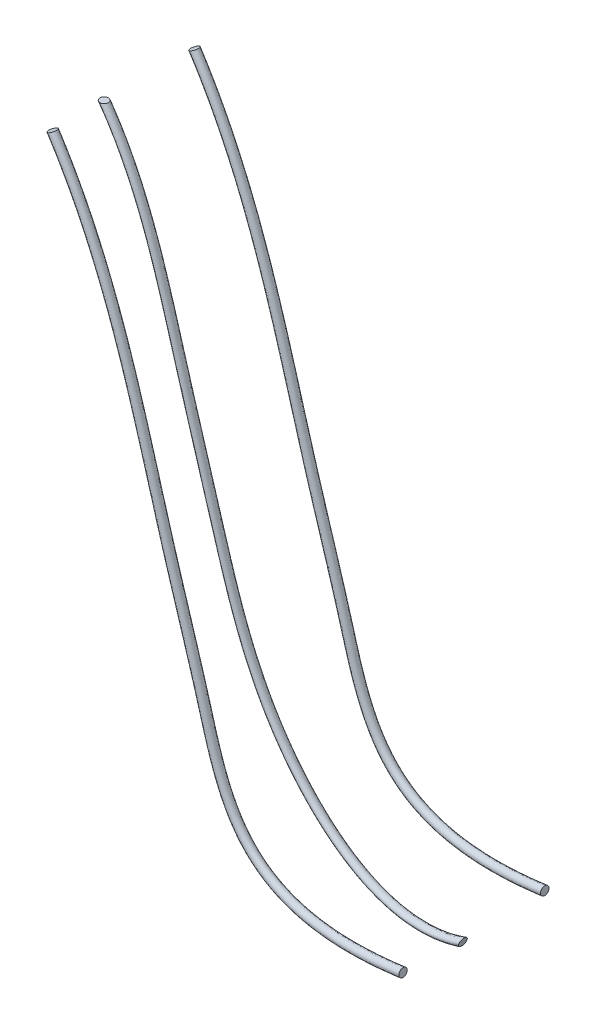
ISO-10303-21;
HEADER;
FILE_DESCRIPTION(('STEP AP214'),'2;1');
FILE_NAME('part.step','',(''),(''),'','','');
FILE_SCHEMA(('AUTOMOTIVE_DESIGN { 1 0 10303 214 1 1 1 1 }'));
ENDSEC;
DATA;
#1=APPLICATION_CONTEXT('core data for automotive mechanical design processes');
#2=APPLICATION_PROTOCOL_DEFINITION('international standard','automotive_design',2000,#1);
#3=PRODUCT_CONTEXT('',#1,'mechanical');
#4=PRODUCT('Part','Part','',(#3));
#5=PRODUCT_RELATED_PRODUCT_CATEGORY('part','',(#4));
#6=PRODUCT_DEFINITION_FORMATION('','',#4);
#7=PRODUCT_DEFINITION_CONTEXT('part definition',#1,'design');
#8=PRODUCT_DEFINITION('design','',#6,#7);
#9=PRODUCT_DEFINITION_SHAPE('','',#8);
#10=(LENGTH_UNIT() NAMED_UNIT(*) SI_UNIT(.MILLI.,.METRE.));
#11=(NAMED_UNIT(*) PLANE_ANGLE_UNIT() SI_UNIT($,.RADIAN.));
#12=(NAMED_UNIT(*) SI_UNIT($,.STERADIAN.) SOLID_ANGLE_UNIT());
#13=UNCERTAINTY_MEASURE_WITH_UNIT(LENGTH_MEASURE(1.E-05),#10,'distance_accuracy_value','');
#14=(GEOMETRIC_REPRESENTATION_CONTEXT(3) GLOBAL_UNCERTAINTY_ASSIGNED_CONTEXT((#13)) GLOBAL_UNIT_ASSIGNED_CONTEXT((#10,
#11,#12)) REPRESENTATION_CONTEXT('',''));
#15=CARTESIAN_POINT('',(0.,0.,0.));
#16=DIRECTION('',(0.,0.,1.));
#17=DIRECTION('',(1.,0.,0.));
#18=AXIS2_PLACEMENT_3D('',#15,#16,#17);
#19=CARTESIAN_POINT('',(16.916534127983,-52.611531021806,-35.));
#20=DIRECTION('',(-0.958927457331722,0.283651426182417,0.));
#21=DIRECTION('',(0.,0.,1.));
#22=AXIS2_PLACEMENT_3D('',#19,#20,#21);
#23=PLANE('',#22);
#24=CARTESIAN_POINT('',(16.916534127983,-52.611531021806,-35.));
#25=DIRECTION('',(-0.958927457331722,0.283651426182417,0.));
#26=DIRECTION('',(0.,0.,1.));
#27=AXIS2_PLACEMENT_3D('',#24,#25,#26);
#28=CIRCLE('',#27,1.5);
#29=CARTESIAN_POINT('',(16.916534127983,-52.611531021806,-33.5));
#30=VERTEX_POINT('',#29);
#31=EDGE_CURVE('E52',#30,#30,#28,.T.);
#32=ORIENTED_EDGE('',*,*,#31,.F.);
#33=EDGE_LOOP('',(#32));
#34=FACE_BOUND('',#33,.T.);
#35=ADVANCED_FACE('F45',(#34),#23,.F.);
#36=CARTESIAN_POINT('',(-109.591861813485,141.197501941776,-35.));
#37=DIRECTION('',(0.,1.,0.));
#38=DIRECTION('',(0.,0.,1.));
#39=AXIS2_PLACEMENT_3D('',#36,#37,#38);
#40=PLANE('',#39);
#41=CARTESIAN_POINT('',(-109.591861813485,141.197501941776,-35.));
#42=DIRECTION('',(0.,1.,0.));
#43=DIRECTION('',(0.,0.,1.));
#44=AXIS2_PLACEMENT_3D('',#41,#42,#43);
#45=CIRCLE('',#44,1.5);
#46=CARTESIAN_POINT('',(-109.591861813485,141.197501941776,-33.5));
#47=VERTEX_POINT('',#46);
#48=EDGE_CURVE('E12',#47,#47,#45,.T.);
#49=ORIENTED_EDGE('',*,*,#48,.T.);
#50=EDGE_LOOP('',(#49));
#51=FACE_BOUND('',#50,.T.);
#52=ADVANCED_FACE('F59',(#51),#40,.T.);
#53=CARTESIAN_POINT('',(16.916534127983,-52.611531021806,-33.5));
#54=CARTESIAN_POINT('',(9.55705648597828,-55.1380302823063,-33.5));
#55=CARTESIAN_POINT('',(2.43598615035813,-55.5558375818441,-33.5));
#56=CARTESIAN_POINT('',(-11.0949119735034,-53.168356726781,-33.5));
#57=CARTESIAN_POINT('',(-17.5047397627201,-50.3630685711351,-33.5));
#58=CARTESIAN_POINT('',(-35.315717416291,-38.603993631756,-33.5));
#59=CARTESIAN_POINT('',(-45.2983615667628,-26.306996369571,-33.5000000000508));
#60=CARTESIAN_POINT('',(-60.4202481334853,0.703109142676461,-33.4999999999434));
#61=CARTESIAN_POINT('',(-64.878410153124,15.5318857768422,-33.4999999999459));
#62=CARTESIAN_POINT('',(-74.0719650388109,46.0665955853019,-33.5000000000565));
#63=CARTESIAN_POINT('',(-78.8109689398716,61.7825785006327,-33.5000000000573));
#64=CARTESIAN_POINT('',(-86.6687995899401,88.7315740177395,-33.4999999999599));
#65=CARTESIAN_POINT('',(-89.8483885261062,99.899973826744,-33.5));
#66=CARTESIAN_POINT('',(-97.9491688366467,121.408362716194,-33.5));
#67=CARTESIAN_POINT('',(-102.870360210734,131.7483517967,-33.4999999998793));
#68=CARTESIAN_POINT('',(-109.591861813485,141.197501941776,-33.5));
#69=CARTESIAN_POINT('',(17.7674884065303,-49.7347486498109,-33.5));
#70=CARTESIAN_POINT('',(10.8805138453547,-52.4010146587241,-33.499999999946));
#71=CARTESIAN_POINT('',(4.23639829818887,-53.1086093205455,-33.5));
#72=CARTESIAN_POINT('',(-8.62080221794834,-51.4050669086179,-33.5));
#73=CARTESIAN_POINT('',(-14.8273642347094,-48.9689108106232,-33.5));
#74=CARTESIAN_POINT('',(-32.2762114074672,-38.1463195765031,-33.5));
#75=CARTESIAN_POINT('',(-42.276048485128,-26.2630477572454,-33.5000000000508));
#76=CARTESIAN_POINT('',(-57.4819897006809,-0.0288475938846101,-33.4999999999434));
#77=CARTESIAN_POINT('',(-62.0365207476715,14.5708107264407,-33.4999999999459));
#78=CARTESIAN_POINT('',(-71.2295501301309,45.1070758149353,-33.5000000000565));
#79=CARTESIAN_POINT('',(-75.9713417112433,60.8146690381452,-33.5000000000573));
#80=CARTESIAN_POINT('',(-83.8393424623326,87.7344104026176,-33.4999999999599));
#81=CARTESIAN_POINT('',(-86.9904353661716,98.9725733570331,-33.5));
#82=CARTESIAN_POINT('',(-95.0058468682263,120.804356353894,-33.5));
#83=CARTESIAN_POINT('',(-99.8703602107739,131.406267637954,-33.4999999998793));
#84=CARTESIAN_POINT('',(-106.591861813485,141.197501941776,-33.5));
#85=CARTESIAN_POINT('',(17.7674884065303,-49.7347486498109,-36.5));
#86=CARTESIAN_POINT('',(10.8805138453547,-52.4010146587241,-36.499999999946));
#87=CARTESIAN_POINT('',(4.23639829818887,-53.1086093205455,-36.5));
#88=CARTESIAN_POINT('',(-8.62080221794834,-51.4050669086179,-36.5));
#89=CARTESIAN_POINT('',(-14.8273642347094,-48.9689108106232,-36.5));
#90=CARTESIAN_POINT('',(-32.2762114074672,-38.1463195765031,-36.5));
#91=CARTESIAN_POINT('',(-42.276048485128,-26.2630477572455,-36.5000000000508));
#92=CARTESIAN_POINT('',(-57.4819897006809,-0.0288475938846032,-36.4999999999434));
#93=CARTESIAN_POINT('',(-62.0365207476715,14.5708107266572,-36.4999999999459));
#94=CARTESIAN_POINT('',(-71.2295501301309,45.1070758147093,-36.5000000000565));
#95=CARTESIAN_POINT('',(-75.9713417112433,60.8146690381452,-36.5000000000572));
#96=CARTESIAN_POINT('',(-83.8393424623326,87.7344104026176,-36.4999999999599));
#97=CARTESIAN_POINT('',(-86.9904353661716,98.9725733570331,-36.5));
#98=CARTESIAN_POINT('',(-95.0058468682263,120.804356353894,-36.5));
#99=CARTESIAN_POINT('',(-99.8703602107739,131.406267637954,-36.4999999998793));
#100=CARTESIAN_POINT('',(-106.591861813485,141.197501941776,-36.5));
#101=CARTESIAN_POINT('',(16.916534127983,-52.611531021806,-36.5));
#102=CARTESIAN_POINT('',(9.55705648597828,-55.1380302823063,-36.5));
#103=CARTESIAN_POINT('',(2.43598615035813,-55.5558375818441,-36.5));
#104=CARTESIAN_POINT('',(-11.0949119735034,-53.168356726781,-36.5));
#105=CARTESIAN_POINT('',(-17.5047397627201,-50.3630685711351,-36.5));
#106=CARTESIAN_POINT('',(-35.315717416291,-38.603993631756,-36.5));
#107=CARTESIAN_POINT('',(-45.2983615667628,-26.306996369571,-36.5000000000508));
#108=CARTESIAN_POINT('',(-60.4202481334853,0.703109142676461,-36.4999999999434));
#109=CARTESIAN_POINT('',(-64.878410153124,15.5318857770587,-36.4999999999459));
#110=CARTESIAN_POINT('',(-74.0719650388109,46.0665955850759,-36.5000000000565));
#111=CARTESIAN_POINT('',(-78.8109689398716,61.7825785006327,-36.5000000000572));
#112=CARTESIAN_POINT('',(-86.6687995899401,88.7315740177395,-36.4999999999599));
#113=CARTESIAN_POINT('',(-89.8483885261062,99.899973826744,-36.5));
#114=CARTESIAN_POINT('',(-97.9491688366467,121.408362716194,-36.5));
#115=CARTESIAN_POINT('',(-102.870360210734,131.7483517967,-36.4999999998793));
#116=CARTESIAN_POINT('',(-109.591861813485,141.197501941776,-36.5));
#117=CARTESIAN_POINT('',(16.0655798494358,-55.4883133938011,-36.5));
#118=CARTESIAN_POINT('',(8.23359912660187,-57.8750459058886,-36.500000000054));
#119=CARTESIAN_POINT('',(0.635574002527383,-58.0030658431427,-36.5));
#120=CARTESIAN_POINT('',(-13.5690217290585,-54.9316465449442,-36.5));
#121=CARTESIAN_POINT('',(-20.1821152907308,-51.7572263316469,-36.5));
#122=CARTESIAN_POINT('',(-38.3552234251148,-39.0616676870089,-36.5));
#123=CARTESIAN_POINT('',(-48.3206746483976,-26.3509449818966,-36.5000000000508));
#124=CARTESIAN_POINT('',(-63.3585065662897,1.43506587923753,-36.4999999999434));
#125=CARTESIAN_POINT('',(-67.7202995585765,16.4929608274602,-36.4999999999459));
#126=CARTESIAN_POINT('',(-76.9143799474908,47.0261153554425,-36.5000000000565));
#127=CARTESIAN_POINT('',(-81.6505961685,62.7504879631201,-36.5000000000572));
#128=CARTESIAN_POINT('',(-89.4982567175476,89.7287376328614,-36.4999999999599));
#129=CARTESIAN_POINT('',(-92.7063416860409,100.827374296455,-36.5));
#130=CARTESIAN_POINT('',(-100.892490805067,122.012369078494,-36.5));
#131=CARTESIAN_POINT('',(-105.870360210693,132.090435955447,-36.4999999998793));
#132=CARTESIAN_POINT('',(-112.591861813485,141.197501941776,-36.5));
#133=CARTESIAN_POINT('',(16.0655798494358,-55.4883133938011,-33.5));
#134=CARTESIAN_POINT('',(8.23359912660187,-57.8750459058886,-33.500000000054));
#135=CARTESIAN_POINT('',(0.635574002527383,-58.0030658431427,-33.5));
#136=CARTESIAN_POINT('',(-13.5690217290585,-54.9316465449442,-33.5));
#137=CARTESIAN_POINT('',(-20.1821152907308,-51.7572263316469,-33.5));
#138=CARTESIAN_POINT('',(-38.3552234251148,-39.0616676870089,-33.5));
#139=CARTESIAN_POINT('',(-48.3206746483976,-26.3509449818966,-33.5000000000508));
#140=CARTESIAN_POINT('',(-63.3585065662898,1.43506587923753,-33.4999999999434));
#141=CARTESIAN_POINT('',(-67.7202995585765,16.4929608272437,-33.4999999999459));
#142=CARTESIAN_POINT('',(-76.9143799474908,47.0261153556685,-33.5000000000565));
#143=CARTESIAN_POINT('',(-81.6505961685,62.7504879631201,-33.5000000000573));
#144=CARTESIAN_POINT('',(-89.4982567175476,89.7287376328614,-33.4999999999599));
#145=CARTESIAN_POINT('',(-92.7063416860409,100.827374296455,-33.5));
#146=CARTESIAN_POINT('',(-100.892490805067,122.012369078494,-33.5));
#147=CARTESIAN_POINT('',(-105.870360210693,132.090435955447,-33.4999999998793));
#148=CARTESIAN_POINT('',(-112.591861813485,141.197501941776,-33.5));
#149=CARTESIAN_POINT('',(16.916534127983,-52.611531021806,-33.5));
#150=CARTESIAN_POINT('',(9.55705648597828,-55.1380302823063,-33.5));
#151=CARTESIAN_POINT('',(2.43598615035813,-55.5558375818441,-33.5));
#152=CARTESIAN_POINT('',(-11.0949119735034,-53.168356726781,-33.5));
#153=CARTESIAN_POINT('',(-17.5047397627201,-50.3630685711351,-33.5));
#154=CARTESIAN_POINT('',(-35.315717416291,-38.603993631756,-33.5));
#155=CARTESIAN_POINT('',(-45.2983615667628,-26.306996369571,-33.5000000000508));
#156=CARTESIAN_POINT('',(-60.4202481334853,0.703109142676461,-33.4999999999434));
#157=CARTESIAN_POINT('',(-64.878410153124,15.5318857768422,-33.4999999999459));
#158=CARTESIAN_POINT('',(-74.0719650388109,46.0665955853019,-33.5000000000565));
#159=CARTESIAN_POINT('',(-78.8109689398716,61.7825785006327,-33.5000000000573));
#160=CARTESIAN_POINT('',(-86.6687995899401,88.7315740177395,-33.4999999999599));
#161=CARTESIAN_POINT('',(-89.8483885261062,99.899973826744,-33.5));
#162=CARTESIAN_POINT('',(-97.9491688366467,121.408362716194,-33.5));
#163=CARTESIAN_POINT('',(-102.870360210734,131.7483517967,-33.4999999998793));
#164=CARTESIAN_POINT('',(-109.591861813485,141.197501941776,-33.5));
#165=(BOUNDED_SURFACE() B_SPLINE_SURFACE(3,3,((#53,#54,#55,#56,#57,#58,#59,#60,#61,#62,#63,#64,
#65,#66,#67,#68),(#69,#70,#71,#72,#73,#74,#75,#76,#77,#78,#79,#80,#81,#82,#83,#84),(#85,#86,#87,
#88,#89,#90,#91,#92,#93,#94,#95,#96,#97,#98,#99,#100),(#101,#102,#103,#104,#105,#106,#107,#108,
#109,#110,#111,#112,#113,#114,#115,#116),(#117,#118,#119,#120,#121,#122,#123,#124,#125,#126,
#127,#128,#129,#130,#131,#132),(#133,#134,#135,#136,#137,#138,#139,#140,#141,#142,#143,#144,
#145,#146,#147,#148),(#149,#150,#151,#152,#153,#154,#155,#156,#157,#158,#159,#160,#161,#162,
#163,#164)),.UNSPECIFIED.,.T.,.F.,.F.) B_SPLINE_SURFACE_WITH_KNOTS((4,3,4),(4,2,2,2,2,2,2,4),
(0.,0.5,1.),(0.,0.0846577276563609,0.169315455312722,0.338630910625443,0.527229255251966,
0.724052923284721,0.862026461642361,1.),
.UNSPECIFIED.) GEOMETRIC_REPRESENTATION_ITEM() RATIONAL_B_SPLINE_SURFACE(((1.,1.,1.,1.,1.,1.,1.,
1.,1.,1.,1.,1.,1.,1.,1.,1.),(0.333333333333333,0.333333333333333,0.333333333333333,
0.333333333333333,0.333333333333333,0.333333333333333,0.333333333333333,0.333333333333333,
0.333333333333333,0.333333333333333,0.333333333333333,0.333333333333333,0.333333333333333,
0.333333333333333,0.333333333333333,0.333333333333333),(0.333333333333333,0.333333333333333,
0.333333333333333,0.333333333333333,0.333333333333333,0.333333333333333,0.333333333333333,
0.333333333333333,0.333333333333333,0.333333333333333,0.333333333333333,0.333333333333333,
0.333333333333333,0.333333333333333,0.333333333333333,0.333333333333333),(1.,1.,1.,1.,1.,1.,1.,
1.,1.,1.,1.,1.,1.,1.,1.,1.),(0.333333333333333,0.333333333333333,0.333333333333333,
0.333333333333333,0.333333333333333,0.333333333333333,0.333333333333333,0.333333333333333,
0.333333333333333,0.333333333333333,0.333333333333333,0.333333333333333,0.333333333333333,
0.333333333333333,0.333333333333333,0.333333333333333),(0.333333333333333,0.333333333333333,
0.333333333333333,0.333333333333333,0.333333333333333,0.333333333333333,0.333333333333333,
0.333333333333333,0.333333333333333,0.333333333333333,0.333333333333333,0.333333333333333,
0.333333333333333,0.333333333333333,0.333333333333333,0.333333333333333),(1.,1.,1.,1.,1.,1.,1.,
1.,1.,1.,1.,1.,1.,1.,1.,1.))) REPRESENTATION_ITEM('') SURFACE());
#166=ORIENTED_EDGE('',*,*,#48,.F.);
#167=EDGE_LOOP('',(#166));
#168=FACE_BOUND('',#167,.T.);
#169=ORIENTED_EDGE('',*,*,#31,.T.);
#170=EDGE_LOOP('',(#169));
#171=FACE_BOUND('',#170,.T.);
#172=ADVANCED_FACE('F61',(#168,#171),#165,.T.);
#173=CLOSED_SHELL('',(#35,#52,#172));
#174=MANIFOLD_SOLID_BREP('B2',#173);
#175=CARTESIAN_POINT('',(20.7871925197467,-47.5155249257654,-60.));
#176=DIRECTION('',(1.,0.,0.));
#177=DIRECTION('',(0.,0.,-1.));
#178=AXIS2_PLACEMENT_3D('',#175,#176,#177);
#179=PLANE('',#178);
#180=CARTESIAN_POINT('',(20.7871925197467,-47.5155249257654,-60.));
#181=DIRECTION('',(1.,0.,0.));
#182=DIRECTION('',(0.,0.,-1.));
#183=AXIS2_PLACEMENT_3D('',#180,#181,#182);
#184=CIRCLE('',#183,1.5);
#185=CARTESIAN_POINT('',(20.7871925197467,-47.5155249257654,-61.5));
#186=VERTEX_POINT('',#185);
#187=EDGE_CURVE('E110',#186,#186,#184,.T.);
#188=ORIENTED_EDGE('',*,*,#187,.T.);
#189=EDGE_LOOP('',(#188));
#190=FACE_BOUND('',#189,.T.);
#191=ADVANCED_FACE('F103',(#190),#179,.T.);
#192=CARTESIAN_POINT('',(-102.757957414721,147.936211365141,-60.));
#193=DIRECTION('',(0.421750342883305,-0.906711998529751,0.));
#194=DIRECTION('',(0.,0.,-1.));
#195=AXIS2_PLACEMENT_3D('',#192,#193,#194);
#196=PLANE('',#195);
#197=CARTESIAN_POINT('',(-102.757957414721,147.936211365141,-60.));
#198=DIRECTION('',(0.421750342883305,-0.906711998529751,0.));
#199=DIRECTION('',(0.,0.,-1.));
#200=AXIS2_PLACEMENT_3D('',#197,#198,#199);
#201=CIRCLE('',#200,1.5);
#202=CARTESIAN_POINT('',(-102.757957414721,147.936211365141,-61.5));
#203=VERTEX_POINT('',#202);
#204=EDGE_CURVE('E43',#203,#203,#201,.T.);
#205=ORIENTED_EDGE('',*,*,#204,.F.);
#206=EDGE_LOOP('',(#205));
#207=FACE_BOUND('',#206,.T.);
#208=ADVANCED_FACE('F119',(#207),#196,.F.);
#209=CARTESIAN_POINT('',(20.7871925197467,-47.5155249257654,-61.5));
#210=CARTESIAN_POINT('',(6.67032582434194,-49.4776645493738,-61.5));
#211=CARTESIAN_POINT('',(-4.29139426145453,-49.2009446173639,-61.5));
#212=CARTESIAN_POINT('',(-21.5401859863186,-45.3074124619637,-61.5));
#213=CARTESIAN_POINT('',(-27.827257623269,-41.6906002375903,-61.5));
#214=CARTESIAN_POINT('',(-37.3623972233158,-32.2545103218831,-61.5));
#215=CARTESIAN_POINT('',(-40.6104651827423,-26.4352326278541,-61.5));
#216=CARTESIAN_POINT('',(-45.7032421986823,-13.7318385949111,-61.5));
#217=CARTESIAN_POINT('',(-47.5479512519977,-6.84772225350563,-61.5000000000247));
#218=CARTESIAN_POINT('',(-53.3149364191524,13.2918461274146,-61.499999999952));
#219=CARTESIAN_POINT('',(-57.558663360849,26.4465696156744,-61.5));
#220=CARTESIAN_POINT('',(-67.0231898161266,58.2397176307574,-61.5));
#221=CARTESIAN_POINT('',(-71.9580815041171,76.971572830989,-61.5));
#222=CARTESIAN_POINT('',(-84.446806300493,113.492342820483,-61.5));
#223=CARTESIAN_POINT('',(-92.0006394080635,131.281257610009,-61.5));
#224=CARTESIAN_POINT('',(-102.757957414721,147.936211365141,-61.5));
#225=CARTESIAN_POINT('',(20.7871925197467,-44.5155249257654,-61.5));
#226=CARTESIAN_POINT('',(6.92055083697571,-46.4776645493491,-61.5));
#227=CARTESIAN_POINT('',(-3.68807037354514,-46.2224964242823,-61.5));
#228=CARTESIAN_POINT('',(-20.0292196853693,-42.6707224557401,-61.5));
#229=CARTESIAN_POINT('',(-25.7787964130944,-39.4303756113549,-61.5));
#230=CARTESIAN_POINT('',(-34.6434899554663,-30.8716321778494,-61.5));
#231=CARTESIAN_POINT('',(-37.758504023246,-25.4719326589793,-61.5));
#232=CARTESIAN_POINT('',(-42.7317306964101,-13.2504357716397,-61.5));
#233=CARTESIAN_POINT('',(-44.5728376137831,-6.46059722549588,-61.5000000000247));
#234=CARTESIAN_POINT('',(-50.3539201014126,13.7784456497104,-61.499999999952));
#235=CARTESIAN_POINT('',(-54.599747060689,26.9434377008006,-61.5));
#236=CARTESIAN_POINT('',(-64.0478551561822,58.6288485126884,-61.5));
#237=CARTESIAN_POINT('',(-68.985425278444,77.4006570278042,-61.5));
#238=CARTESIAN_POINT('',(-81.52901632821,114.204592750462,-61.5));
#239=CARTESIAN_POINT('',(-89.139846202586,132.244112725622,-61.5));
#240=CARTESIAN_POINT('',(-100.037821419132,149.201462393791,-61.5));
#241=CARTESIAN_POINT('',(20.7871925197467,-44.5155249257654,-58.5));
#242=CARTESIAN_POINT('',(6.92055083697571,-46.4776645493491,-58.5));
#243=CARTESIAN_POINT('',(-3.68807037354514,-46.2224964242823,-58.5));
#244=CARTESIAN_POINT('',(-20.0292196853693,-42.6707224557401,-58.5));
#245=CARTESIAN_POINT('',(-25.7787964130944,-39.4303756113549,-58.5));
#246=CARTESIAN_POINT('',(-34.6434899554663,-30.8716321778494,-58.5));
#247=CARTESIAN_POINT('',(-37.758504023246,-25.4719326589793,-58.5));
#248=CARTESIAN_POINT('',(-42.7317306964101,-13.2504357716397,-58.5));
#249=CARTESIAN_POINT('',(-44.5728376137831,-6.46059722550824,-58.5000000000247));
#250=CARTESIAN_POINT('',(-50.3539201014126,13.7784456497344,-58.499999999952));
#251=CARTESIAN_POINT('',(-54.599747060689,26.9434377008006,-58.5));
#252=CARTESIAN_POINT('',(-64.0478551561822,58.6288485126884,-58.5));
#253=CARTESIAN_POINT('',(-68.985425278444,77.4006570278042,-58.5));
#254=CARTESIAN_POINT('',(-81.52901632821,114.204592750462,-58.5));
#255=CARTESIAN_POINT('',(-89.139846202586,132.244112725622,-58.5));
#256=CARTESIAN_POINT('',(-100.037821419132,149.201462393791,-58.5));
#257=CARTESIAN_POINT('',(20.7871925197467,-47.5155249257654,-58.5));
#258=CARTESIAN_POINT('',(6.67032582434194,-49.4776645493738,-58.5));
#259=CARTESIAN_POINT('',(-4.29139426145453,-49.2009446173639,-58.5));
#260=CARTESIAN_POINT('',(-21.5401859863186,-45.3074124619637,-58.5));
#261=CARTESIAN_POINT('',(-27.827257623269,-41.6906002375903,-58.5));
#262=CARTESIAN_POINT('',(-37.3623972233158,-32.2545103218831,-58.5));
#263=CARTESIAN_POINT('',(-40.6104651827423,-26.4352326278541,-58.5));
#264=CARTESIAN_POINT('',(-45.7032421986823,-13.7318385949111,-58.5));
#265=CARTESIAN_POINT('',(-47.5479512519977,-6.84772225351799,-58.5000000000247));
#266=CARTESIAN_POINT('',(-53.3149364191524,13.2918461274386,-58.499999999952));
#267=CARTESIAN_POINT('',(-57.558663360849,26.4465696156744,-58.5));
#268=CARTESIAN_POINT('',(-67.0231898161266,58.2397176307574,-58.5));
#269=CARTESIAN_POINT('',(-71.9580815041171,76.971572830989,-58.5));
#270=CARTESIAN_POINT('',(-84.446806300493,113.492342820483,-58.5));
#271=CARTESIAN_POINT('',(-92.0006394080635,131.281257610009,-58.5));
#272=CARTESIAN_POINT('',(-102.757957414721,147.936211365141,-58.5));
#273=CARTESIAN_POINT('',(20.7871925197467,-50.5155249257655,-58.5));
#274=CARTESIAN_POINT('',(6.42010081170817,-52.4776645493986,-58.5));
#275=CARTESIAN_POINT('',(-4.89471814936392,-52.1793928104455,-58.5));
#276=CARTESIAN_POINT('',(-23.0511522872679,-47.9441024681873,-58.5));
#277=CARTESIAN_POINT('',(-29.8757188334437,-43.9508248638257,-58.5));
#278=CARTESIAN_POINT('',(-40.0813044911653,-33.6373884659168,-58.5));
#279=CARTESIAN_POINT('',(-43.4624263422385,-27.398532596729,-58.5));
#280=CARTESIAN_POINT('',(-48.6747537009545,-14.2132414181826,-58.5));
#281=CARTESIAN_POINT('',(-50.5230648902123,-7.23484728152775,-58.5000000000247));
#282=CARTESIAN_POINT('',(-56.2759527368923,12.8052466051428,-58.499999999952));
#283=CARTESIAN_POINT('',(-60.517579661009,25.9497015305481,-58.5));
#284=CARTESIAN_POINT('',(-69.998524476071,57.8505867488265,-58.5));
#285=CARTESIAN_POINT('',(-74.9307377297903,76.5424886341737,-58.5));
#286=CARTESIAN_POINT('',(-87.3645962727761,112.780092890505,-58.5));
#287=CARTESIAN_POINT('',(-94.861432613541,130.318402494396,-58.5));
#288=CARTESIAN_POINT('',(-105.478093410311,146.670960336491,-58.5));
#289=CARTESIAN_POINT('',(20.7871925197467,-50.5155249257655,-61.5));
#290=CARTESIAN_POINT('',(6.42010081170817,-52.4776645493986,-61.5));
#291=CARTESIAN_POINT('',(-4.89471814936392,-52.1793928104455,-61.5));
#292=CARTESIAN_POINT('',(-23.0511522872679,-47.9441024681873,-61.5));
#293=CARTESIAN_POINT('',(-29.8757188334437,-43.9508248638257,-61.5));
#294=CARTESIAN_POINT('',(-40.0813044911653,-33.6373884659168,-61.5));
#295=CARTESIAN_POINT('',(-43.4624263422385,-27.398532596729,-61.5));
#296=CARTESIAN_POINT('',(-48.6747537009545,-14.2132414181826,-61.5));
#297=CARTESIAN_POINT('',(-50.5230648902123,-7.23484728151539,-61.5000000000247));
#298=CARTESIAN_POINT('',(-56.2759527368923,12.8052466051188,-61.499999999952));
#299=CARTESIAN_POINT('',(-60.517579661009,25.9497015305481,-61.5));
#300=CARTESIAN_POINT('',(-69.998524476071,57.8505867488265,-61.5));
#301=CARTESIAN_POINT('',(-74.9307377297903,76.5424886341737,-61.5));
#302=CARTESIAN_POINT('',(-87.3645962727761,112.780092890505,-61.5));
#303=CARTESIAN_POINT('',(-94.861432613541,130.318402494396,-61.5));
#304=CARTESIAN_POINT('',(-105.478093410311,146.670960336491,-61.5));
#305=CARTESIAN_POINT('',(20.7871925197467,-47.5155249257654,-61.5));
#306=CARTESIAN_POINT('',(6.67032582434194,-49.4776645493738,-61.5));
#307=CARTESIAN_POINT('',(-4.29139426145453,-49.2009446173639,-61.5));
#308=CARTESIAN_POINT('',(-21.5401859863186,-45.3074124619637,-61.5));
#309=CARTESIAN_POINT('',(-27.827257623269,-41.6906002375903,-61.5));
#310=CARTESIAN_POINT('',(-37.3623972233158,-32.2545103218831,-61.5));
#311=CARTESIAN_POINT('',(-40.6104651827423,-26.4352326278541,-61.5));
#312=CARTESIAN_POINT('',(-45.7032421986823,-13.7318385949111,-61.5));
#313=CARTESIAN_POINT('',(-47.5479512519977,-6.84772225350563,-61.5000000000247));
#314=CARTESIAN_POINT('',(-53.3149364191524,13.2918461274146,-61.499999999952));
#315=CARTESIAN_POINT('',(-57.558663360849,26.4465696156744,-61.5));
#316=CARTESIAN_POINT('',(-67.0231898161266,58.2397176307574,-61.5));
#317=CARTESIAN_POINT('',(-71.9580815041171,76.971572830989,-61.5));
#318=CARTESIAN_POINT('',(-84.446806300493,113.492342820483,-61.5));
#319=CARTESIAN_POINT('',(-92.0006394080635,131.281257610009,-61.5));
#320=CARTESIAN_POINT('',(-102.757957414721,147.936211365141,-61.5));
#321=(BOUNDED_SURFACE() B_SPLINE_SURFACE(3,3,((#209,#210,#211,#212,#213,#214,#215,#216,#217,
#218,#219,#220,#221,#222,#223,#224),(#225,#226,#227,#228,#229,#230,#231,#232,#233,#234,#235,
#236,#237,#238,#239,#240),(#241,#242,#243,#244,#245,#246,#247,#248,#249,#250,#251,#252,#253,
#254,#255,#256),(#257,#258,#259,#260,#261,#262,#263,#264,#265,#266,#267,#268,#269,#270,#271,
#272),(#273,#274,#275,#276,#277,#278,#279,#280,#281,#282,#283,#284,#285,#286,#287,#288),(#289,
#290,#291,#292,#293,#294,#295,#296,#297,#298,#299,#300,#301,#302,#303,#304),(#305,#306,#307,
#308,#309,#310,#311,#312,#313,#314,#315,#316,#317,#318,#319,#320)),.UNSPECIFIED.,.T.,.F.,
.F.) B_SPLINE_SURFACE_WITH_KNOTS((4,3,4),(4,2,2,2,2,2,2,4),(0.,0.5,1.),(0.,0.0879322033366029,
0.175864406673206,0.263796610009809,0.351728813346412,0.522410577753008,0.761205288876504,1.),
.UNSPECIFIED.) GEOMETRIC_REPRESENTATION_ITEM() RATIONAL_B_SPLINE_SURFACE(((1.,1.,1.,1.,1.,1.,1.,
1.,1.,1.,1.,1.,1.,1.,1.,1.),(0.333333333333333,0.333333333333333,0.333333333333333,
0.333333333333333,0.333333333333333,0.333333333333333,0.333333333333333,0.333333333333333,
0.333333333333333,0.333333333333333,0.333333333333333,0.333333333333333,0.333333333333333,
0.333333333333333,0.333333333333333,0.333333333333333),(0.333333333333333,0.333333333333333,
0.333333333333333,0.333333333333333,0.333333333333333,0.333333333333333,0.333333333333333,
0.333333333333333,0.333333333333333,0.333333333333333,0.333333333333333,0.333333333333333,
0.333333333333333,0.333333333333333,0.333333333333333,0.333333333333333),(1.,1.,1.,1.,1.,1.,1.,
1.,1.,1.,1.,1.,1.,1.,1.,1.),(0.333333333333333,0.333333333333333,0.333333333333333,
0.333333333333333,0.333333333333333,0.333333333333333,0.333333333333333,0.333333333333333,
0.333333333333333,0.333333333333333,0.333333333333333,0.333333333333333,0.333333333333333,
0.333333333333333,0.333333333333333,0.333333333333333),(0.333333333333333,0.333333333333333,
0.333333333333333,0.333333333333333,0.333333333333333,0.333333333333333,0.333333333333333,
0.333333333333333,0.333333333333333,0.333333333333333,0.333333333333333,0.333333333333333,
0.333333333333333,0.333333333333333,0.333333333333333,0.333333333333333),(1.,1.,1.,1.,1.,1.,1.,
1.,1.,1.,1.,1.,1.,1.,1.,1.))) REPRESENTATION_ITEM('') SURFACE());
#322=ORIENTED_EDGE('',*,*,#204,.T.);
#323=EDGE_LOOP('',(#322));
#324=FACE_BOUND('',#323,.T.);
#325=ORIENTED_EDGE('',*,*,#187,.F.);
#326=EDGE_LOOP('',(#325));
#327=FACE_BOUND('',#326,.T.);
#328=ADVANCED_FACE('F117',(#324,#327),#321,.F.);
#329=CLOSED_SHELL('',(#191,#208,#328));
#330=MANIFOLD_SOLID_BREP('B6',#329);
#331=CARTESIAN_POINT('',(20.7871925197467,-47.5155249257654,-10.));
#332=DIRECTION('',(1.,0.,0.));
#333=DIRECTION('',(0.,0.,-1.));
#334=AXIS2_PLACEMENT_3D('',#331,#332,#333);
#335=PLANE('',#334);
#336=CARTESIAN_POINT('',(20.7871925197467,-47.5155249257654,-10.));
#337=DIRECTION('',(1.,0.,0.));
#338=DIRECTION('',(0.,0.,-1.));
#339=AXIS2_PLACEMENT_3D('',#336,#337,#338);
#340=CIRCLE('',#339,1.5);
#341=CARTESIAN_POINT('',(20.7871925197467,-47.5155249257654,-11.5));
#342=VERTEX_POINT('',#341);
#343=EDGE_CURVE('E159',#342,#342,#340,.T.);
#344=ORIENTED_EDGE('',*,*,#343,.T.);
#345=EDGE_LOOP('',(#344));
#346=FACE_BOUND('',#345,.T.);
#347=ADVANCED_FACE('F152',(#346),#335,.T.);
#348=CARTESIAN_POINT('',(-102.757957414721,147.936211365141,-10.));
#349=DIRECTION('',(0.421750342883305,-0.906711998529751,0.));
#350=DIRECTION('',(0.,0.,-1.));
#351=AXIS2_PLACEMENT_3D('',#348,#349,#350);
#352=PLANE('',#351);
#353=CARTESIAN_POINT('',(-102.757957414721,147.936211365141,-10.));
#354=DIRECTION('',(0.421750342883305,-0.906711998529751,0.));
#355=DIRECTION('',(0.,0.,-1.));
#356=AXIS2_PLACEMENT_3D('',#353,#354,#355);
#357=CIRCLE('',#356,1.5);
#358=CARTESIAN_POINT('',(-102.757957414721,147.936211365141,-11.5));
#359=VERTEX_POINT('',#358);
#360=EDGE_CURVE('E101',#359,#359,#357,.T.);
#361=ORIENTED_EDGE('',*,*,#360,.F.);
#362=EDGE_LOOP('',(#361));
#363=FACE_BOUND('',#362,.T.);
#364=ADVANCED_FACE('F168',(#363),#352,.F.);
#365=CARTESIAN_POINT('',(20.7871925197467,-47.5155249257654,-11.5));
#366=CARTESIAN_POINT('',(6.67032582434194,-49.4776645493738,-11.5));
#367=CARTESIAN_POINT('',(-4.29139426145453,-49.2009446173639,-11.5));
#368=CARTESIAN_POINT('',(-21.5401859863186,-45.3074124619637,-11.5));
#369=CARTESIAN_POINT('',(-27.827257623269,-41.6906002375903,-11.4999999999942));
#370=CARTESIAN_POINT('',(-37.3623972233158,-32.2545103218831,-11.5000000000058));
#371=CARTESIAN_POINT('',(-40.6104651827423,-26.4352326278541,-11.5000000000059));
#372=CARTESIAN_POINT('',(-45.7032421986823,-13.7318385949111,-11.4999999999941));
#373=CARTESIAN_POINT('',(-47.5479512519977,-6.84772225351799,-11.5));
#374=CARTESIAN_POINT('',(-53.3149364191524,13.2918461274386,-11.5));
#375=CARTESIAN_POINT('',(-57.558663360849,26.4465696156744,-11.5));
#376=CARTESIAN_POINT('',(-67.0231898161266,58.2397176307574,-11.5));
#377=CARTESIAN_POINT('',(-71.9580815041171,76.971572830989,-11.5));
#378=CARTESIAN_POINT('',(-84.446806300493,113.492342820483,-11.5));
#379=CARTESIAN_POINT('',(-92.0006394080635,131.281257610009,-11.5));
#380=CARTESIAN_POINT('',(-102.757957414721,147.936211365141,-11.5));
#381=CARTESIAN_POINT('',(20.7871925197467,-44.5155249257654,-11.5));
#382=CARTESIAN_POINT('',(6.92055083697571,-46.4776645493491,-11.5));
#383=CARTESIAN_POINT('',(-3.68807037353747,-46.2224964242823,-11.5));
#384=CARTESIAN_POINT('',(-20.029219685377,-42.6707224557401,-11.5));
#385=CARTESIAN_POINT('',(-25.7787964130595,-39.4303756113316,-11.4999999999942));
#386=CARTESIAN_POINT('',(-34.6434899555013,-30.8716321778727,-11.5000000000058));
#387=CARTESIAN_POINT('',(-37.758504023246,-25.4719326589555,-11.5000000000059));
#388=CARTESIAN_POINT('',(-42.7317306964101,-13.2504357716634,-11.4999999999941));
#389=CARTESIAN_POINT('',(-44.5728376137831,-6.46059722550824,-11.5));
#390=CARTESIAN_POINT('',(-50.3539201014126,13.7784456497344,-11.5));
#391=CARTESIAN_POINT('',(-54.599747060689,26.9434377008006,-11.5));
#392=CARTESIAN_POINT('',(-64.0478551561822,58.6288485126884,-11.5));
#393=CARTESIAN_POINT('',(-68.9854252783771,77.4006570278712,-11.5));
#394=CARTESIAN_POINT('',(-81.529016328277,114.204592750395,-11.5));
#395=CARTESIAN_POINT('',(-89.139846202242,132.244112725071,-11.5));
#396=CARTESIAN_POINT('',(-100.037821419132,149.201462393791,-11.5));
#397=CARTESIAN_POINT('',(20.7871925197467,-44.5155249257654,-8.50000000000001));
#398=CARTESIAN_POINT('',(6.92055083697571,-46.4776645493491,-8.50000000000001));
#399=CARTESIAN_POINT('',(-3.68807037353747,-46.2224964242823,-8.50000000000001));
#400=CARTESIAN_POINT('',(-20.029219685377,-42.6707224557401,-8.50000000000001));
#401=CARTESIAN_POINT('',(-25.7787964130595,-39.4303756113316,-8.49999999999419));
#402=CARTESIAN_POINT('',(-34.6434899555013,-30.8716321778727,-8.50000000000583));
#403=CARTESIAN_POINT('',(-37.758504023246,-25.4719326589555,-8.50000000000594));
#404=CARTESIAN_POINT('',(-42.7317306964101,-13.2504357716634,-8.49999999999407));
#405=CARTESIAN_POINT('',(-44.5728376137831,-6.46059722550824,-8.50000000000001));
#406=CARTESIAN_POINT('',(-50.3539201014126,13.7784456497344,-8.50000000000001));
#407=CARTESIAN_POINT('',(-54.599747060689,26.9434377008006,-8.50000000000001));
#408=CARTESIAN_POINT('',(-64.0478551561822,58.6288485126883,-8.50000000000001));
#409=CARTESIAN_POINT('',(-68.9854252783771,77.4006570278712,-8.50000000000001));
#410=CARTESIAN_POINT('',(-81.529016328277,114.204592750395,-8.50000000000001));
#411=CARTESIAN_POINT('',(-89.139846202242,132.244112725071,-8.50000000000001));
#412=CARTESIAN_POINT('',(-100.037821419132,149.201462393791,-8.50000000000001));
#413=CARTESIAN_POINT('',(20.7871925197467,-47.5155249257654,-8.50000000000001));
#414=CARTESIAN_POINT('',(6.67032582434194,-49.4776645493738,-8.50000000000001));
#415=CARTESIAN_POINT('',(-4.29139426145453,-49.2009446173639,-8.50000000000001));
#416=CARTESIAN_POINT('',(-21.5401859863186,-45.3074124619637,-8.50000000000001));
#417=CARTESIAN_POINT('',(-27.827257623269,-41.6906002375903,-8.49999999999419));
#418=CARTESIAN_POINT('',(-37.3623972233158,-32.2545103218831,-8.50000000000583));
#419=CARTESIAN_POINT('',(-40.6104651827423,-26.4352326278541,-8.50000000000594));
#420=CARTESIAN_POINT('',(-45.7032421986823,-13.7318385949111,-8.49999999999407));
#421=CARTESIAN_POINT('',(-47.5479512519977,-6.84772225351799,-8.50000000000001));
#422=CARTESIAN_POINT('',(-53.3149364191524,13.2918461274386,-8.50000000000001));
#423=CARTESIAN_POINT('',(-57.558663360849,26.4465696156744,-8.50000000000001));
#424=CARTESIAN_POINT('',(-67.0231898161266,58.2397176307574,-8.50000000000001));
#425=CARTESIAN_POINT('',(-71.9580815041171,76.971572830989,-8.50000000000001));
#426=CARTESIAN_POINT('',(-84.446806300493,113.492342820483,-8.50000000000001));
#427=CARTESIAN_POINT('',(-92.0006394080635,131.281257610009,-8.50000000000001));
#428=CARTESIAN_POINT('',(-102.757957414721,147.936211365141,-8.50000000000001));
#429=CARTESIAN_POINT('',(20.7871925197467,-50.5155249257654,-8.50000000000001));
#430=CARTESIAN_POINT('',(6.42010081170817,-52.4776645493985,-8.50000000000001));
#431=CARTESIAN_POINT('',(-4.89471814937158,-52.1793928104455,-8.50000000000001));
#432=CARTESIAN_POINT('',(-23.0511522872602,-47.9441024681873,-8.50000000000001));
#433=CARTESIAN_POINT('',(-29.8757188334786,-43.950824863849,-8.49999999999419));
#434=CARTESIAN_POINT('',(-40.0813044911303,-33.6373884658935,-8.50000000000583));
#435=CARTESIAN_POINT('',(-43.4624263422385,-27.3985325967527,-8.50000000000594));
#436=CARTESIAN_POINT('',(-48.6747537009545,-14.2132414181588,-8.49999999999407));
#437=CARTESIAN_POINT('',(-50.5230648902123,-7.23484728152774,-8.50000000000001));
#438=CARTESIAN_POINT('',(-56.2759527368923,12.8052466051428,-8.50000000000001));
#439=CARTESIAN_POINT('',(-60.517579661009,25.9497015305481,-8.50000000000001));
#440=CARTESIAN_POINT('',(-69.998524476071,57.8505867488265,-8.50000000000001));
#441=CARTESIAN_POINT('',(-74.9307377298572,76.5424886341068,-8.50000000000001));
#442=CARTESIAN_POINT('',(-87.3645962727091,112.780092890572,-8.50000000000001));
#443=CARTESIAN_POINT('',(-94.8614326138849,130.318402494946,-8.50000000000001));
#444=CARTESIAN_POINT('',(-105.478093410311,146.670960336491,-8.50000000000001));
#445=CARTESIAN_POINT('',(20.7871925197467,-50.5155249257654,-11.5));
#446=CARTESIAN_POINT('',(6.42010081170817,-52.4776645493985,-11.5));
#447=CARTESIAN_POINT('',(-4.89471814937158,-52.1793928104455,-11.5));
#448=CARTESIAN_POINT('',(-23.0511522872602,-47.9441024681873,-11.5));
#449=CARTESIAN_POINT('',(-29.8757188334786,-43.950824863849,-11.4999999999942));
#450=CARTESIAN_POINT('',(-40.0813044911303,-33.6373884658935,-11.5000000000058));
#451=CARTESIAN_POINT('',(-43.4624263422385,-27.3985325967527,-11.5000000000059));
#452=CARTESIAN_POINT('',(-48.6747537009545,-14.2132414181588,-11.4999999999941));
#453=CARTESIAN_POINT('',(-50.5230648902123,-7.23484728152775,-11.5));
#454=CARTESIAN_POINT('',(-56.2759527368923,12.8052466051428,-11.5));
#455=CARTESIAN_POINT('',(-60.517579661009,25.9497015305481,-11.5));
#456=CARTESIAN_POINT('',(-69.998524476071,57.8505867488265,-11.5));
#457=CARTESIAN_POINT('',(-74.9307377298572,76.5424886341068,-11.5));
#458=CARTESIAN_POINT('',(-87.3645962727091,112.780092890572,-11.5));
#459=CARTESIAN_POINT('',(-94.8614326138849,130.318402494946,-11.5));
#460=CARTESIAN_POINT('',(-105.478093410311,146.670960336491,-11.5));
#461=CARTESIAN_POINT('',(20.7871925197467,-47.5155249257654,-11.5));
#462=CARTESIAN_POINT('',(6.67032582434194,-49.4776645493738,-11.5));
#463=CARTESIAN_POINT('',(-4.29139426145453,-49.2009446173639,-11.5));
#464=CARTESIAN_POINT('',(-21.5401859863186,-45.3074124619637,-11.5));
#465=CARTESIAN_POINT('',(-27.827257623269,-41.6906002375903,-11.4999999999942));
#466=CARTESIAN_POINT('',(-37.3623972233158,-32.2545103218831,-11.5000000000058));
#467=CARTESIAN_POINT('',(-40.6104651827423,-26.4352326278541,-11.5000000000059));
#468=CARTESIAN_POINT('',(-45.7032421986823,-13.7318385949111,-11.4999999999941));
#469=CARTESIAN_POINT('',(-47.5479512519977,-6.84772225351799,-11.5));
#470=CARTESIAN_POINT('',(-53.3149364191524,13.2918461274386,-11.5));
#471=CARTESIAN_POINT('',(-57.558663360849,26.4465696156744,-11.5));
#472=CARTESIAN_POINT('',(-67.0231898161266,58.2397176307574,-11.5));
#473=CARTESIAN_POINT('',(-71.9580815041171,76.971572830989,-11.5));
#474=CARTESIAN_POINT('',(-84.446806300493,113.492342820483,-11.5));
#475=CARTESIAN_POINT('',(-92.0006394080635,131.281257610009,-11.5));
#476=CARTESIAN_POINT('',(-102.757957414721,147.936211365141,-11.5));
#477=(BOUNDED_SURFACE() B_SPLINE_SURFACE(3,3,((#365,#366,#367,#368,#369,#370,#371,#372,#373,
#374,#375,#376,#377,#378,#379,#380),(#381,#382,#383,#384,#385,#386,#387,#388,#389,#390,#391,
#392,#393,#394,#395,#396),(#397,#398,#399,#400,#401,#402,#403,#404,#405,#406,#407,#408,#409,
#410,#411,#412),(#413,#414,#415,#416,#417,#418,#419,#420,#421,#422,#423,#424,#425,#426,#427,
#428),(#429,#430,#431,#432,#433,#434,#435,#436,#437,#438,#439,#440,#441,#442,#443,#444),(#445,
#446,#447,#448,#449,#450,#451,#452,#453,#454,#455,#456,#457,#458,#459,#460),(#461,#462,#463,
#464,#465,#466,#467,#468,#469,#470,#471,#472,#473,#474,#475,#476)),.UNSPECIFIED.,.T.,.F.,
.F.) B_SPLINE_SURFACE_WITH_KNOTS((4,3,4),(4,2,2,2,2,2,2,4),(0.,0.5,1.),(0.,0.0879322033366029,
0.175864406673206,0.263796610009809,0.351728813346412,0.522410577753008,0.761205288876504,1.),
.UNSPECIFIED.) GEOMETRIC_REPRESENTATION_ITEM() RATIONAL_B_SPLINE_SURFACE(((1.,1.,1.,1.,1.,1.,1.,
1.,1.,1.,1.,1.,1.,1.,1.,1.),(0.333333333333333,0.333333333333333,0.333333333333333,
0.333333333333333,0.333333333333333,0.333333333333333,0.333333333333333,0.333333333333333,
0.333333333333333,0.333333333333333,0.333333333333333,0.333333333333333,0.333333333333333,
0.333333333333333,0.333333333333333,0.333333333333333),(0.333333333333333,0.333333333333333,
0.333333333333333,0.333333333333333,0.333333333333333,0.333333333333333,0.333333333333333,
0.333333333333333,0.333333333333333,0.333333333333333,0.333333333333333,0.333333333333333,
0.333333333333333,0.333333333333333,0.333333333333333,0.333333333333333),(1.,1.,1.,1.,1.,1.,1.,
1.,1.,1.,1.,1.,1.,1.,1.,1.),(0.333333333333333,0.333333333333333,0.333333333333333,
0.333333333333333,0.333333333333333,0.333333333333333,0.333333333333333,0.333333333333333,
0.333333333333333,0.333333333333333,0.333333333333333,0.333333333333333,0.333333333333333,
0.333333333333333,0.333333333333333,0.333333333333333),(0.333333333333333,0.333333333333333,
0.333333333333333,0.333333333333333,0.333333333333333,0.333333333333333,0.333333333333333,
0.333333333333333,0.333333333333333,0.333333333333333,0.333333333333333,0.333333333333333,
0.333333333333333,0.333333333333333,0.333333333333333,0.333333333333333),(1.,1.,1.,1.,1.,1.,1.,
1.,1.,1.,1.,1.,1.,1.,1.,1.))) REPRESENTATION_ITEM('') SURFACE());
#478=ORIENTED_EDGE('',*,*,#360,.T.);
#479=EDGE_LOOP('',(#478));
#480=FACE_BOUND('',#479,.T.);
#481=ORIENTED_EDGE('',*,*,#343,.F.);
#482=EDGE_LOOP('',(#481));
#483=FACE_BOUND('',#482,.T.);
#484=ADVANCED_FACE('F166',(#480,#483),#477,.F.);
#485=CLOSED_SHELL('',(#347,#364,#484));
#486=MANIFOLD_SOLID_BREP('B37',#485);
#487=ADVANCED_BREP_SHAPE_REPRESENTATION('',(#18,#174,#330,#486),#14);
#488=SHAPE_DEFINITION_REPRESENTATION(#9,#487);
ENDSEC;
END-ISO-10303-21;
